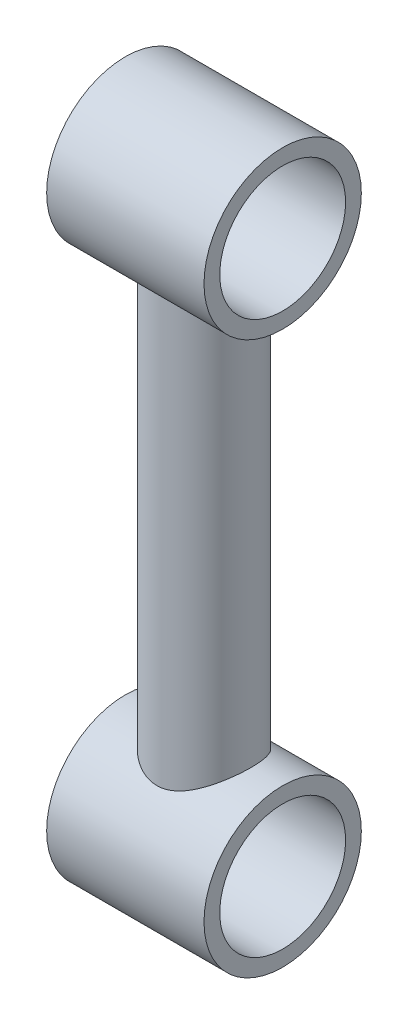
ISO-10303-21;
HEADER;
FILE_DESCRIPTION(('STEP AP214'),'2;1');
FILE_NAME('part.step','',(''),(''),'','','');
FILE_SCHEMA(('AUTOMOTIVE_DESIGN { 1 0 10303 214 1 1 1 1 }'));
ENDSEC;
DATA;
#1=APPLICATION_CONTEXT('core data for automotive mechanical design processes');
#2=APPLICATION_PROTOCOL_DEFINITION('international standard','automotive_design',2000,#1);
#3=PRODUCT_CONTEXT('',#1,'mechanical');
#4=PRODUCT('Part','Part','',(#3));
#5=PRODUCT_RELATED_PRODUCT_CATEGORY('part','',(#4));
#6=PRODUCT_DEFINITION_FORMATION('','',#4);
#7=PRODUCT_DEFINITION_CONTEXT('part definition',#1,'design');
#8=PRODUCT_DEFINITION('design','',#6,#7);
#9=PRODUCT_DEFINITION_SHAPE('','',#8);
#10=(LENGTH_UNIT() NAMED_UNIT(*) SI_UNIT(.MILLI.,.METRE.));
#11=(NAMED_UNIT(*) PLANE_ANGLE_UNIT() SI_UNIT($,.RADIAN.));
#12=(NAMED_UNIT(*) SI_UNIT($,.STERADIAN.) SOLID_ANGLE_UNIT());
#13=UNCERTAINTY_MEASURE_WITH_UNIT(LENGTH_MEASURE(1.E-05),#10,'distance_accuracy_value','');
#14=(GEOMETRIC_REPRESENTATION_CONTEXT(3) GLOBAL_UNCERTAINTY_ASSIGNED_CONTEXT((#13)) GLOBAL_UNIT_ASSIGNED_CONTEXT((#10,
#11,#12)) REPRESENTATION_CONTEXT('',''));
#15=CARTESIAN_POINT('',(0.,0.,0.));
#16=DIRECTION('',(0.,0.,1.));
#17=DIRECTION('',(1.,0.,0.));
#18=AXIS2_PLACEMENT_3D('',#15,#16,#17);
#19=CARTESIAN_POINT('',(-50.,0.,0.));
#20=DIRECTION('',(1.,0.,0.));
#21=DIRECTION('',(0.,0.,-1.));
#22=AXIS2_PLACEMENT_3D('',#19,#20,#21);
#23=CYLINDRICAL_SURFACE('',#22,50.);
#24=CARTESIAN_POINT('',(50.,0.,0.));
#25=DIRECTION('',(1.,0.,0.));
#26=DIRECTION('',(0.,0.,-1.));
#27=AXIS2_PLACEMENT_3D('',#24,#25,#26);
#28=CIRCLE('',#27,50.);
#29=CARTESIAN_POINT('',(50.,0.,-50.));
#30=VERTEX_POINT('',#29);
#31=EDGE_CURVE('E40',#30,#30,#28,.T.);
#32=ORIENTED_EDGE('',*,*,#31,.F.);
#33=EDGE_LOOP('',(#32));
#34=FACE_BOUND('',#33,.T.);
#35=CARTESIAN_POINT('',(-50.,0.,0.));
#36=DIRECTION('',(1.,0.,0.));
#37=DIRECTION('',(0.,0.,-1.));
#38=AXIS2_PLACEMENT_3D('',#35,#36,#37);
#39=CIRCLE('',#38,50.);
#40=CARTESIAN_POINT('',(-50.,0.,-50.));
#41=VERTEX_POINT('',#40);
#42=EDGE_CURVE('E10',#41,#41,#39,.T.);
#43=ORIENTED_EDGE('',*,*,#42,.T.);
#44=EDGE_LOOP('',(#43));
#45=FACE_BOUND('',#44,.T.);
#46=CARTESIAN_POINT('',(0.,-40.,-30.));
#47=CARTESIAN_POINT('',(0.754773079428565,-39.9999924355509,-30.0000054371733));
#48=CARTESIAN_POINT('',(1.50948924622845,-40.0214403954393,-29.9714752342614));
#49=CARTESIAN_POINT('',(3.0122226461602,-40.1062444493847,-29.8578998383123));
#50=CARTESIAN_POINT('',(3.76024032191946,-40.1695977533699,-29.7728584078095));
#51=CARTESIAN_POINT('',(5.2441364599569,-40.3355499097489,-29.5476372030003));
#52=CARTESIAN_POINT('',(5.98000318745316,-40.438184622088,-29.4074070436577));
#53=CARTESIAN_POINT('',(7.43373400086841,-40.6785728662393,-29.0739716563499));
#54=CARTESIAN_POINT('',(8.15159714350204,-40.8163282339694,-28.8807636589501));
#55=CARTESIAN_POINT('',(9.55986424580085,-41.1208174466127,-28.445531905068));
#56=CARTESIAN_POINT('',(10.2504322497716,-41.2873290187728,-28.2038804459786));
#57=CARTESIAN_POINT('',(11.6067524308452,-41.644790948041,-27.6733374325039));
#58=CARTESIAN_POINT('',(12.2725013269922,-41.8357445215649,-27.3844396594046));
#59=CARTESIAN_POINT('',(13.2505717076948,-42.1364605134893,-26.9175218389558));
#60=CARTESIAN_POINT('',(13.5732271148505,-42.2391003045645,-26.756254628249));
#61=CARTESIAN_POINT('',(14.2113934734989,-42.4484734074239,-26.4228282782668));
#62=CARTESIAN_POINT('',(14.5269062595888,-42.5552056486378,-26.2506719799854));
#63=CARTESIAN_POINT('',(15.4626009873731,-42.8806472634173,-25.7181480386));
#64=CARTESIAN_POINT('',(16.0719201724563,-43.1045955804228,-25.3417344973462));
#65=CARTESIAN_POINT('',(17.3324425072035,-43.5893887462092,-24.499575785768));
#66=CARTESIAN_POINT('',(17.9796546133088,-43.8513964328546,-24.0285354757498));
#67=CARTESIAN_POINT('',(19.233290460478,-44.3801358051688,-23.0373408991427));
#68=CARTESIAN_POINT('',(19.8397118501679,-44.6468677620499,-22.5171838053726));
#69=CARTESIAN_POINT('',(21.0099367523766,-45.1790404761606,-21.4294452953907));
#70=CARTESIAN_POINT('',(21.573709768574,-45.4444801847927,-20.8618305432127));
#71=CARTESIAN_POINT('',(22.6556839826832,-45.9679876279243,-19.681488615426));
#72=CARTESIAN_POINT('',(23.1738828552944,-46.2260549858159,-19.0687591408844));
#73=CARTESIAN_POINT('',(24.2153507973842,-46.7564021460829,-17.7316223686081));
#74=CARTESIAN_POINT('',(24.7330987799033,-47.0271973104288,-17.0023054886216));
#75=CARTESIAN_POINT('',(25.7047112154735,-47.5453815754836,-15.4942685286804));
#76=CARTESIAN_POINT('',(26.158569862743,-47.7927685483637,-14.715543968244));
#77=CARTESIAN_POINT('',(26.9971922251109,-48.2568802958075,-13.1136665383535));
#78=CARTESIAN_POINT('',(27.3820041074603,-48.4736264229592,-12.2905451657093));
#79=CARTESIAN_POINT('',(28.0777989799473,-48.870041879193,-10.6050928823802));
#80=CARTESIAN_POINT('',(28.3887941027499,-49.0497173006521,-9.74276844298749));
#81=CARTESIAN_POINT('',(28.9062031952631,-49.3510766635053,-8.06989441005334));
#82=CARTESIAN_POINT('',(29.1197644658465,-49.4766580911894,-7.26225533212928));
#83=CARTESIAN_POINT('',(29.4794276662173,-49.6891894498777,-5.62706899055213));
#84=CARTESIAN_POINT('',(29.6255335070595,-49.7761416205889,-4.79952288403311));
#85=CARTESIAN_POINT('',(29.8478515838854,-49.9087796773502,-3.13246717024253));
#86=CARTESIAN_POINT('',(29.924118545397,-49.9544978737898,-2.29296745458034));
#87=CARTESIAN_POINT('',(30.0056462782551,-50.0033768126454,-0.609322714269916));
#88=CARTESIAN_POINT('',(30.0109142739014,-50.0065418849347,0.234821829012514));
#89=CARTESIAN_POINT('',(29.95415500019,-49.9725033434349,1.81489529981785));
#90=CARTESIAN_POINT('',(29.9004022371462,-49.9402633154867,2.55124667795299));
#91=CARTESIAN_POINT('',(29.739124395353,-49.8438693758083,4.01585794086052));
#92=CARTESIAN_POINT('',(29.6316048566647,-49.7797187521094,4.74411865138387));
#93=CARTESIAN_POINT('',(29.3641437085351,-49.620977165127,6.18756243161352));
#94=CARTESIAN_POINT('',(29.20420022,-49.5263851106974,6.90274503157525));
#95=CARTESIAN_POINT('',(28.8337670024337,-49.3088598139461,8.31547959196037));
#96=CARTESIAN_POINT('',(28.6232751906837,-49.1859254038559,9.01303082461759));
#97=CARTESIAN_POINT('',(28.1526581576168,-48.9135476146462,10.3904072750655));
#98=CARTESIAN_POINT('',(27.8922569228414,-48.7639571594241,11.0701088227145));
#99=CARTESIAN_POINT('',(27.3251067169327,-48.441789827711,12.4041910107697));
#100=CARTESIAN_POINT('',(27.0183581811358,-48.2692131671293,13.0585718889383));
#101=CARTESIAN_POINT('',(26.3610135406394,-47.9043659781244,14.3392870539587));
#102=CARTESIAN_POINT('',(26.0104113625566,-47.7120927225473,14.9656174396906));
#103=CARTESIAN_POINT('',(25.2678641870583,-47.3113861831583,16.1878487666349));
#104=CARTESIAN_POINT('',(24.8759165978422,-47.1029518864841,16.783747796732));
#105=CARTESIAN_POINT('',(24.0038251222862,-46.6479274519125,18.0124884902317));
#106=CARTESIAN_POINT('',(23.5187386533106,-46.3997536842666,18.6412397419404));
#107=CARTESIAN_POINT('',(22.502607304962,-45.8930644751573,19.8559772510624));
#108=CARTESIAN_POINT('',(21.9715592593429,-45.6345483218784,20.4419605571017));
#109=CARTESIAN_POINT('',(20.8653945949799,-45.1123778800076,21.569887598821));
#110=CARTESIAN_POINT('',(20.2902225786288,-44.8487174528413,22.1117741531459));
#111=CARTESIAN_POINT('',(19.0986815642021,-44.3223864406096,23.1487409834838));
#112=CARTESIAN_POINT('',(18.4823106652618,-44.0597159018081,23.6438190972658));
#113=CARTESIAN_POINT('',(17.1365792062999,-43.5114023855333,24.6397506704863));
#114=CARTESIAN_POINT('',(16.4024071704545,-43.2266309181986,25.134607075518));
#115=CARTESIAN_POINT('',(14.8880542042171,-42.6750161739419,26.060187845091));
#116=CARTESIAN_POINT('',(14.107865737769,-42.4081758489753,26.4909016641373));
#117=CARTESIAN_POINT('',(12.5060980569954,-41.9025771259453,27.2835991057643));
#118=CARTESIAN_POINT('',(11.6845832451743,-41.663776855557,27.6456857193192));
#119=CARTESIAN_POINT('',(10.0036296959614,-41.2239700066492,28.2973336841537));
#120=CARTESIAN_POINT('',(9.144206012938,-41.0229485892923,28.586923525734));
#121=CARTESIAN_POINT('',(7.61055439517443,-40.7124607158074,29.0266922229524));
#122=CARTESIAN_POINT('',(6.94318574540926,-40.5926498926779,29.1936352760004));
#123=CARTESIAN_POINT('',(5.59394741557895,-40.3837646228614,29.4819157838905));
#124=CARTESIAN_POINT('',(4.91208006934632,-40.2946852685501,29.6032605207762));
#125=CARTESIAN_POINT('',(3.53871644845567,-40.1504262123343,29.7986252970483));
#126=CARTESIAN_POINT('',(2.847230409919,-40.0952129290315,29.8726922198134));
#127=CARTESIAN_POINT('',(1.45881623193731,-40.0205909917451,29.9725913229736));
#128=CARTESIAN_POINT('',(0.761887977392609,-40.0011830970955,29.9984224804208));
#129=CARTESIAN_POINT('',(-0.633092969562075,-39.9989205730711,30.001439292512));
#130=CARTESIAN_POINT('',(-1.33114588996814,-40.016116263115,29.9785579814936));
#131=CARTESIAN_POINT('',(-2.72212786656803,-40.0864993514701,29.8843768935634));
#132=CARTESIAN_POINT('',(-3.41505689605442,-40.1396869372494,29.8130768644567));
#133=CARTESIAN_POINT('',(-4.79132027707059,-40.2801155116223,29.6230684849219));
#134=CARTESIAN_POINT('',(-5.47464786325117,-40.3673793756117,29.5043282866804));
#135=CARTESIAN_POINT('',(-6.82695351863887,-40.5729035284754,29.2210546703214));
#136=CARTESIAN_POINT('',(-7.49593118416539,-40.6911646881071,29.0565199657639));
#137=CARTESIAN_POINT('',(-8.81493130388343,-40.9546817127304,28.6838971255832));
#138=CARTESIAN_POINT('',(-9.46498244311764,-41.099893970628,28.4758792783311));
#139=CARTESIAN_POINT('',(-10.7447421919884,-41.4133350881076,28.0180764187168));
#140=CARTESIAN_POINT('',(-11.3744425052817,-41.5815731918176,27.7682746224651));
#141=CARTESIAN_POINT('',(-12.6112149171688,-41.9367586997092,27.2288911048792));
#142=CARTESIAN_POINT('',(-13.2182827026054,-42.1237096452986,26.9393018498846));
#143=CARTESIAN_POINT('',(-14.4078239321894,-42.5119906697039,26.3223000055147));
#144=CARTESIAN_POINT('',(-14.9903036233565,-42.713317060781,25.9948971032765));
#145=CARTESIAN_POINT('',(-16.2323716245478,-43.1636078905243,25.2414085206861));
#146=CARTESIAN_POINT('',(-16.8868967379914,-43.4146109863377,24.8081780488878));
#147=CARTESIAN_POINT('',(-18.1580335537829,-43.9246536038002,23.8934940052003));
#148=CARTESIAN_POINT('',(-18.7746418168658,-44.1836938512659,23.4120360691993));
#149=CARTESIAN_POINT('',(-19.9684598947072,-44.7040326920285,22.4025038732756));
#150=CARTESIAN_POINT('',(-20.5456347277241,-44.9653330646558,21.8743891519663));
#151=CARTESIAN_POINT('',(-21.6578301169655,-45.4842796758364,20.7737943393439));
#152=CARTESIAN_POINT('',(-22.1928484895119,-45.7419257245319,20.2013119528565));
#153=CARTESIAN_POINT('',(-23.2851001855273,-46.2811171660542,18.9364779766343));
#154=CARTESIAN_POINT('',(-23.8361500707667,-46.5614043507672,18.2382257014387));
#155=CARTESIAN_POINT('',(-24.8772013130106,-47.1028396436449,16.7904682073809));
#156=CARTESIAN_POINT('',(-25.367196421245,-47.3639857916585,16.0409577545394));
#157=CARTESIAN_POINT('',(-26.281262214501,-47.8597679650153,14.4948690885772));
#158=CARTESIAN_POINT('',(-26.7053644094267,-48.0944166466547,13.6983136253921));
#159=CARTESIAN_POINT('',(-27.4829085808844,-48.5304710877414,12.0627242110709));
#160=CARTESIAN_POINT('',(-27.8363601907911,-48.731881378668,11.2236960707639));
#161=CARTESIAN_POINT('',(-28.4447091895007,-49.0820154369011,9.57163089673217));
#162=CARTESIAN_POINT('',(-28.7048990218314,-49.2335028420043,8.76112996669413));
#163=CARTESIAN_POINT('',(-29.1565507968783,-49.4981910314828,7.11503534150898));
#164=CARTESIAN_POINT('',(-29.3480152961319,-49.6113932400335,6.27944258101491));
#165=CARTESIAN_POINT('',(-29.6590072808807,-49.7959943798632,4.59121918613498));
#166=CARTESIAN_POINT('',(-29.7786025195841,-49.8674326814406,3.73860538410504));
#167=CARTESIAN_POINT('',(-29.9440494730322,-49.9664050743555,2.02375863082273));
#168=CARTESIAN_POINT('',(-29.989910800952,-49.9939448890237,1.16152694827898));
#169=CARTESIAN_POINT('',(-30.0059636845279,-50.0035796163062,-0.44863836959643));
#170=CARTESIAN_POINT('',(-29.9854383726646,-49.9912497430118,-1.19646649879256));
#171=CARTESIAN_POINT('',(-29.8887419424398,-49.9333091422452,-2.68715701856051));
#172=CARTESIAN_POINT('',(-29.8125768518574,-49.8877020198906,-3.43001993824537));
#173=CARTESIAN_POINT('',(-29.6056163790939,-49.7643009048837,-4.90534527411017));
#174=CARTESIAN_POINT('',(-29.4748213780623,-49.6865071367958,-5.63780776281639));
#175=CARTESIAN_POINT('',(-29.160245460038,-49.5005437474305,-7.0873223698818));
#176=CARTESIAN_POINT('',(-28.9764629550249,-49.3923732157727,-7.80437402569054));
#177=CARTESIAN_POINT('',(-28.5614260115334,-49.1500473875609,-9.20713596965784));
#178=CARTESIAN_POINT('',(-28.3309850756384,-49.0163393490528,-9.89316522831643));
#179=CARTESIAN_POINT('',(-27.8232155122072,-48.7246154429874,-11.242249514208));
#180=CARTESIAN_POINT('',(-27.5458880423398,-48.5666001756052,-11.9053051081935));
#181=CARTESIAN_POINT('',(-26.946769704929,-48.2293178600434,-13.2054545723106));
#182=CARTESIAN_POINT('',(-26.6249739638318,-48.0500484828003,-13.8425455868989));
#183=CARTESIAN_POINT('',(-25.9393946780803,-47.6735789595604,-15.0881846024373));
#184=CARTESIAN_POINT('',(-25.5756084922492,-47.4763776858225,-15.6967308045441));
#185=CARTESIAN_POINT('',(-24.7667424868672,-47.0453184951055,-16.9476190424841));
#186=CARTESIAN_POINT('',(-24.317124761882,-46.8098051726833,-17.5864585689585));
#187=CARTESIAN_POINT('',(-23.3721450786188,-46.325936934833,-18.8241654588664));
#188=CARTESIAN_POINT('',(-22.876780423972,-46.0775812628444,-19.4230304625739));
#189=CARTESIAN_POINT('',(-21.8424161446594,-45.5728772295248,-20.5793876993337));
#190=CARTESIAN_POINT('',(-21.3033730570058,-45.3165210670254,-21.1368376378641));
#191=CARTESIAN_POINT('',(-20.1844237054672,-44.8013865884645,-22.2078589213948));
#192=CARTESIAN_POINT('',(-19.6045150692523,-44.5426081325414,-22.7214277151681));
#193=CARTESIAN_POINT('',(-18.329631573187,-43.9954895932492,-23.7652386100365));
#194=CARTESIAN_POINT('',(-17.6293953373685,-43.7075675480209,-24.2893195038196));
#195=CARTESIAN_POINT('',(-16.5443485377289,-43.2851540783708,-25.0295083694434));
#196=CARTESIAN_POINT('',(-16.1768518277079,-43.1459165421275,-25.2686007562634));
#197=CARTESIAN_POINT('',(-15.4304379178484,-42.8716442524079,-25.731195664513));
#198=CARTESIAN_POINT('',(-15.0515165547962,-42.7366110683665,-25.9546924020116));
#199=CARTESIAN_POINT('',(-13.8987545541486,-42.3397557549876,-26.6007590168042));
#200=CARTESIAN_POINT('',(-13.1084169941735,-42.0859808338299,-26.999246247833));
#201=CARTESIAN_POINT('',(-11.4877271374779,-41.6097198076573,-27.7276182166737));
#202=CARTESIAN_POINT('',(-10.6573852109229,-41.3872256518336,-28.0575206168377));
#203=CARTESIAN_POINT('',(-9.42187298081651,-41.0929389990196,-28.4850286249539));
#204=CARTESIAN_POINT('',(-9.03038758470868,-41.0048657325039,-28.6115719641199));
#205=CARTESIAN_POINT('',(-8.24078837678755,-40.8382373313778,-28.8489055913011));
#206=CARTESIAN_POINT('',(-7.84267626508385,-40.7596797970073,-28.9596998522838));
#207=CARTESIAN_POINT('',(-6.63922693192673,-40.5395886546573,-29.2678307379545));
#208=CARTESIAN_POINT('',(-5.82460119453231,-40.4135940279387,-29.440976404297));
#209=CARTESIAN_POINT('',(-4.17951386891395,-40.209493955114,-29.7191257226127));
#210=CARTESIAN_POINT('',(-3.34908470349394,-40.1312994945307,-29.8242560556143));
#211=CARTESIAN_POINT('',(-1.67907944636471,-40.0265599738779,-29.9646857763522));
#212=CARTESIAN_POINT('',(-0.839504519189612,-40.0000084136404,-29.9999939524452));
#213=CARTESIAN_POINT('',(0.,-40.,-30.));
#214=B_SPLINE_CURVE_WITH_KNOTS('',3,(#46,#47,#48,#49,#50,#51,#52,#53,#54,#55,#56,#57,#58,#59,
#60,#61,#62,#63,#64,#65,#66,#67,#68,#69,#70,#71,#72,#73,#74,#75,#76,#77,#78,#79,#80,#81,#82,#83,
#84,#85,#86,#87,#88,#89,#90,#91,#92,#93,#94,#95,#96,#97,#98,#99,#100,#101,#102,#103,#104,#105,
#106,#107,#108,#109,#110,#111,#112,#113,#114,#115,#116,#117,#118,#119,#120,#121,#122,#123,#124,
#125,#126,#127,#128,#129,#130,#131,#132,#133,#134,#135,#136,#137,#138,#139,#140,#141,#142,#143,
#144,#145,#146,#147,#148,#149,#150,#151,#152,#153,#154,#155,#156,#157,#158,#159,#160,#161,#162,
#163,#164,#165,#166,#167,#168,#169,#170,#171,#172,#173,#174,#175,#176,#177,#178,#179,#180,#181,
#182,#183,#184,#185,#186,#187,#188,#189,#190,#191,#192,#193,#194,#195,#196,#197,#198,#199,#200,
#201,#202,#203,#204,#205,#206,#207,#208,#209,#210,#211,#212,#213),.UNSPECIFIED.,.T.,.F.,(4,2,2,
2,2,2,2,2,2,2,2,2,2,2,2,2,2,2,2,2,2,2,2,2,2,2,2,2,2,2,2,2,2,2,2,2,2,2,2,2,2,2,2,2,2,2,2,2,2,2,2,
2,2,2,2,2,2,2,2,2,2,2,2,2,2,2,2,2,2,2,2,2,2,2,2,2,2,2,2,2,2,2,2,4),(0.,2.26339065976523,
4.52663063739906,6.79194167103308,9.05737114715353,11.3060153718576,13.5549558090047,
14.6798398054329,15.8044315174353,18.053680844433,20.578006829107,23.1024782036475,
25.6287380005962,28.1551266186056,30.954941350871,33.7550103451903,36.553118342749,
39.3507661189212,41.8814765390891,44.4120402106454,46.9406192393127,49.4689409776018,
51.683333411791,53.8974977247651,56.1117414113421,58.3260763460167,60.5530302662239,
62.7799632701391,65.0072050288865,67.2345864887666,69.7280443332067,72.2216740863463,
74.71848750613,77.2154162053875,80.002108172649,82.7892577871951,85.5721909336379,
88.354028700165,90.446781170665,92.5391992867496,94.6295392047497,96.7199234526042,
98.8131832342802,100.906453919041,103.001132238211,105.095869406138,107.187246361405,
109.279465412906,111.372081168462,113.46416201983,115.933925800171,118.403913272111,
120.876064180349,123.348343060374,126.142642921312,128.937228535818,131.730473642596,
134.523337623591,137.113418055671,139.703402128459,142.290940703078,144.878141895905,
147.120010063233,149.361635392023,151.603245081396,153.844921958156,156.05044208409,
158.25590776179,160.461615342147,162.667461736035,165.112763633141,167.558209750834,
170.006119860739,172.454172194157,175.21302745175,176.592687183034,177.972855896356,
180.731292892543,183.489018638118,184.750877047949,186.012416565873,188.534926127152,
191.052723792891,193.57020452896),.UNSPECIFIED.);
#215=CARTESIAN_POINT('',(0.,-40.,-30.));
#216=VERTEX_POINT('',#215);
#217=EDGE_CURVE('E55',#216,#216,#214,.T.);
#218=ORIENTED_EDGE('',*,*,#217,.F.);
#219=EDGE_LOOP('',(#218));
#220=FACE_BOUND('',#219,.T.);
#221=ADVANCED_FACE('F37',(#34,#45,#220),#23,.T.);
#222=CARTESIAN_POINT('',(-50.,0.,0.));
#223=DIRECTION('',(1.,0.,0.));
#224=DIRECTION('',(0.,0.,-1.));
#225=AXIS2_PLACEMENT_3D('',#222,#223,#224);
#226=PLANE('',#225);
#227=CARTESIAN_POINT('',(-50.,0.,0.));
#228=DIRECTION('',(1.,0.,0.));
#229=DIRECTION('',(0.,0.,-1.));
#230=AXIS2_PLACEMENT_3D('',#227,#228,#229);
#231=CIRCLE('',#230,40.);
#232=CARTESIAN_POINT('',(-50.,0.,-40.));
#233=VERTEX_POINT('',#232);
#234=EDGE_CURVE('E49',#233,#233,#231,.T.);
#235=ORIENTED_EDGE('',*,*,#234,.T.);
#236=EDGE_LOOP('',(#235));
#237=FACE_BOUND('',#236,.T.);
#238=ORIENTED_EDGE('',*,*,#42,.F.);
#239=EDGE_LOOP('',(#238));
#240=FACE_BOUND('',#239,.T.);
#241=ADVANCED_FACE('F101',(#237,#240),#226,.F.);
#242=CARTESIAN_POINT('',(50.,0.,0.));
#243=DIRECTION('',(1.,0.,0.));
#244=DIRECTION('',(0.,0.,-1.));
#245=AXIS2_PLACEMENT_3D('',#242,#243,#244);
#246=PLANE('',#245);
#247=CARTESIAN_POINT('',(50.,0.,0.));
#248=DIRECTION('',(1.,0.,0.));
#249=DIRECTION('',(0.,0.,-1.));
#250=AXIS2_PLACEMENT_3D('',#247,#248,#249);
#251=CIRCLE('',#250,40.);
#252=CARTESIAN_POINT('',(50.,0.,-40.));
#253=VERTEX_POINT('',#252);
#254=EDGE_CURVE('E51',#253,#253,#251,.T.);
#255=ORIENTED_EDGE('',*,*,#254,.F.);
#256=EDGE_LOOP('',(#255));
#257=FACE_BOUND('',#256,.T.);
#258=ORIENTED_EDGE('',*,*,#31,.T.);
#259=EDGE_LOOP('',(#258));
#260=FACE_BOUND('',#259,.T.);
#261=ADVANCED_FACE('F106',(#257,#260),#246,.T.);
#262=CARTESIAN_POINT('',(-50.,0.,0.));
#263=DIRECTION('',(1.,0.,0.));
#264=DIRECTION('',(0.,0.,-1.));
#265=AXIS2_PLACEMENT_3D('',#262,#263,#264);
#266=CYLINDRICAL_SURFACE('',#265,40.);
#267=ORIENTED_EDGE('',*,*,#234,.F.);
#268=EDGE_LOOP('',(#267));
#269=FACE_BOUND('',#268,.T.);
#270=ORIENTED_EDGE('',*,*,#254,.T.);
#271=EDGE_LOOP('',(#270));
#272=FACE_BOUND('',#271,.T.);
#273=ADVANCED_FACE('F115',(#269,#272),#266,.F.);
#274=CARTESIAN_POINT('',(0.,50.001,0.));
#275=DIRECTION('',(0.,-1.,0.));
#276=DIRECTION('',(0.,0.,-1.));
#277=AXIS2_PLACEMENT_3D('',#274,#275,#276);
#278=CYLINDRICAL_SURFACE('',#277,30.);
#279=ORIENTED_EDGE('',*,*,#217,.T.);
#280=EDGE_LOOP('',(#279));
#281=FACE_BOUND('',#280,.T.);
#282=CARTESIAN_POINT('',(0.,-311.2,30.));
#283=CARTESIAN_POINT('',(-0.754773079428563,-311.200007564449,30.0000054371733));
#284=CARTESIAN_POINT('',(-1.50948924622845,-311.178559604561,29.9714752342614));
#285=CARTESIAN_POINT('',(-3.0122226461602,-311.093755550615,29.8578998383123));
#286=CARTESIAN_POINT('',(-3.76024032191946,-311.03040224663,29.7728584078095));
#287=CARTESIAN_POINT('',(-5.2441364599569,-310.864450090251,29.5476372030003));
#288=CARTESIAN_POINT('',(-5.98000318745316,-310.761815377912,29.4074070436577));
#289=CARTESIAN_POINT('',(-7.43373400086841,-310.521427133761,29.0739716563499));
#290=CARTESIAN_POINT('',(-8.15159714350204,-310.383671766031,28.8807636589501));
#291=CARTESIAN_POINT('',(-9.55986424580085,-310.079182553387,28.445531905068));
#292=CARTESIAN_POINT('',(-10.2504322497716,-309.912670981227,28.2038804459786));
#293=CARTESIAN_POINT('',(-11.6067524308452,-309.555209051959,27.6733374325039));
#294=CARTESIAN_POINT('',(-12.2725013269922,-309.364255478435,27.3844396594046));
#295=CARTESIAN_POINT('',(-13.2505717076948,-309.063539486511,26.9175218389557));
#296=CARTESIAN_POINT('',(-13.5732271148505,-308.960899695436,26.756254628249));
#297=CARTESIAN_POINT('',(-14.211393473499,-308.751526592576,26.4228282782668));
#298=CARTESIAN_POINT('',(-14.5269062595888,-308.644794351362,26.2506719799853));
#299=CARTESIAN_POINT('',(-15.4626009873731,-308.319352736583,25.7181480386));
#300=CARTESIAN_POINT('',(-16.0719201724563,-308.095404419577,25.3417344973462));
#301=CARTESIAN_POINT('',(-17.3324425072035,-307.610611253791,24.499575785768));
#302=CARTESIAN_POINT('',(-17.9796546133088,-307.348603567146,24.0285354757498));
#303=CARTESIAN_POINT('',(-19.233290460478,-306.819864194831,23.0373408991427));
#304=CARTESIAN_POINT('',(-19.8397118501679,-306.55313223795,22.5171838053726));
#305=CARTESIAN_POINT('',(-21.0099367523766,-306.020959523839,21.4294452953907));
#306=CARTESIAN_POINT('',(-21.573709768574,-305.755519815207,20.8618305432127));
#307=CARTESIAN_POINT('',(-22.6556839826831,-305.232012372076,19.681488615426));
#308=CARTESIAN_POINT('',(-23.1738828552944,-304.973945014184,19.0687591408844));
#309=CARTESIAN_POINT('',(-24.2153507973842,-304.443597853917,17.7316223686081));
#310=CARTESIAN_POINT('',(-24.7330987799033,-304.172802689571,17.0023054886216));
#311=CARTESIAN_POINT('',(-25.7047112154735,-303.654618424516,15.4942685286804));
#312=CARTESIAN_POINT('',(-26.158569862743,-303.407231451636,14.715543968244));
#313=CARTESIAN_POINT('',(-26.9971922251109,-302.943119704192,13.1136665383535));
#314=CARTESIAN_POINT('',(-27.3820041074603,-302.726373577041,12.2905451657093));
#315=CARTESIAN_POINT('',(-28.0777989799473,-302.329958120807,10.6050928823802));
#316=CARTESIAN_POINT('',(-28.3887941027499,-302.150282699348,9.74276844298749));
#317=CARTESIAN_POINT('',(-28.9062031952631,-301.848923336495,8.06989441005334));
#318=CARTESIAN_POINT('',(-29.1197644658465,-301.723341908811,7.26225533212928));
#319=CARTESIAN_POINT('',(-29.4794276662173,-301.510810550122,5.62706899055213));
#320=CARTESIAN_POINT('',(-29.6255335070595,-301.423858379411,4.79952288403311));
#321=CARTESIAN_POINT('',(-29.8478515838854,-301.29122032265,3.13246717024253));
#322=CARTESIAN_POINT('',(-29.924118545397,-301.24550212621,2.29296745458034));
#323=CARTESIAN_POINT('',(-30.0056462782551,-301.196623187355,0.609322714269924));
#324=CARTESIAN_POINT('',(-30.0109142739014,-301.193458115065,-0.234821829012507));
#325=CARTESIAN_POINT('',(-29.95415500019,-301.227496656565,-1.81489529981785));
#326=CARTESIAN_POINT('',(-29.9004022371462,-301.259736684513,-2.55124667795299));
#327=CARTESIAN_POINT('',(-29.739124395353,-301.356130624192,-4.01585794086052));
#328=CARTESIAN_POINT('',(-29.6316048566647,-301.420281247891,-4.74411865138387));
#329=CARTESIAN_POINT('',(-29.3641437085351,-301.579022834873,-6.18756243161353));
#330=CARTESIAN_POINT('',(-29.20420022,-301.673614889303,-6.90274503157526));
#331=CARTESIAN_POINT('',(-28.8337670024337,-301.891140186054,-8.31547959196037));
#332=CARTESIAN_POINT('',(-28.6232751906837,-302.014074596144,-9.0130308246176));
#333=CARTESIAN_POINT('',(-28.1526581576168,-302.286452385354,-10.3904072750655));
#334=CARTESIAN_POINT('',(-27.8922569228414,-302.436042840576,-11.0701088227145));
#335=CARTESIAN_POINT('',(-27.3251067169327,-302.758210172289,-12.4041910107697));
#336=CARTESIAN_POINT('',(-27.0183581811358,-302.930786832871,-13.0585718889383));
#337=CARTESIAN_POINT('',(-26.3610135406394,-303.295634021876,-14.3392870539587));
#338=CARTESIAN_POINT('',(-26.0104113625566,-303.487907277453,-14.9656174396906));
#339=CARTESIAN_POINT('',(-25.2678641870583,-303.888613816842,-16.1878487666349));
#340=CARTESIAN_POINT('',(-24.8759165978422,-304.097048113516,-16.783747796732));
#341=CARTESIAN_POINT('',(-24.0038251222862,-304.552072548087,-18.0124884902317));
#342=CARTESIAN_POINT('',(-23.5187386533106,-304.800246315733,-18.6412397419404));
#343=CARTESIAN_POINT('',(-22.502607304962,-305.306935524843,-19.8559772510624));
#344=CARTESIAN_POINT('',(-21.9715592593429,-305.565451678122,-20.4419605571017));
#345=CARTESIAN_POINT('',(-20.8653945949799,-306.087622119992,-21.5698875988211));
#346=CARTESIAN_POINT('',(-20.2902225786288,-306.351282547159,-22.1117741531459));
#347=CARTESIAN_POINT('',(-19.0986815642021,-306.87761355939,-23.1487409834838));
#348=CARTESIAN_POINT('',(-18.4823106652618,-307.140284098192,-23.6438190972658));
#349=CARTESIAN_POINT('',(-17.1365792062999,-307.688597614467,-24.6397506704863));
#350=CARTESIAN_POINT('',(-16.4024071704545,-307.973369081801,-25.134607075518));
#351=CARTESIAN_POINT('',(-14.8880542042171,-308.524983826058,-26.060187845091));
#352=CARTESIAN_POINT('',(-14.107865737769,-308.791824151025,-26.4909016641373));
#353=CARTESIAN_POINT('',(-12.5060980569954,-309.297422874055,-27.2835991057643));
#354=CARTESIAN_POINT('',(-11.6845832451744,-309.536223144443,-27.6456857193192));
#355=CARTESIAN_POINT('',(-10.0036296959614,-309.976029993351,-28.2973336841537));
#356=CARTESIAN_POINT('',(-9.144206012938,-310.177051410708,-28.586923525734));
#357=CARTESIAN_POINT('',(-7.61055439517443,-310.487539284193,-29.0266922229524));
#358=CARTESIAN_POINT('',(-6.94318574540926,-310.607350107322,-29.1936352760004));
#359=CARTESIAN_POINT('',(-5.59394741557896,-310.816235377139,-29.4819157838905));
#360=CARTESIAN_POINT('',(-4.91208006934632,-310.90531473145,-29.6032605207762));
#361=CARTESIAN_POINT('',(-3.53871644845567,-311.049573787666,-29.7986252970483));
#362=CARTESIAN_POINT('',(-2.847230409919,-311.104787070969,-29.8726922198134));
#363=CARTESIAN_POINT('',(-1.45881623193732,-311.179409008255,-29.9725913229736));
#364=CARTESIAN_POINT('',(-0.761887977392608,-311.198816902905,-29.9984224804208));
#365=CARTESIAN_POINT('',(0.633092969562079,-311.201079426929,-30.001439292512));
#366=CARTESIAN_POINT('',(1.33114588996815,-311.183883736885,-29.9785579814936));
#367=CARTESIAN_POINT('',(2.72212786656804,-311.11350064853,-29.8843768935634));
#368=CARTESIAN_POINT('',(3.41505689605444,-311.060313062751,-29.8130768644567));
#369=CARTESIAN_POINT('',(4.79132027707061,-310.919884488378,-29.6230684849219));
#370=CARTESIAN_POINT('',(5.47464786325119,-310.832620624388,-29.5043282866804));
#371=CARTESIAN_POINT('',(6.82695351863888,-310.627096471525,-29.2210546703214));
#372=CARTESIAN_POINT('',(7.4959311841654,-310.508835311893,-29.0565199657639));
#373=CARTESIAN_POINT('',(8.81493130388344,-310.24531828727,-28.6838971255832));
#374=CARTESIAN_POINT('',(9.46498244311765,-310.100106029372,-28.4758792783311));
#375=CARTESIAN_POINT('',(10.7447421919885,-309.786664911892,-28.0180764187168));
#376=CARTESIAN_POINT('',(11.3744425052817,-309.618426808182,-27.7682746224651));
#377=CARTESIAN_POINT('',(12.6112149171688,-309.263241300291,-27.2288911048792));
#378=CARTESIAN_POINT('',(13.2182827026054,-309.076290354701,-26.9393018498846));
#379=CARTESIAN_POINT('',(14.4078239321894,-308.688009330296,-26.3223000055147));
#380=CARTESIAN_POINT('',(14.9903036233565,-308.486682939219,-25.9948971032765));
#381=CARTESIAN_POINT('',(16.2323716245478,-308.036392109476,-25.2414085206861));
#382=CARTESIAN_POINT('',(16.8868967379914,-307.785389013662,-24.8081780488878));
#383=CARTESIAN_POINT('',(18.158033553783,-307.2753463962,-23.8934940052002));
#384=CARTESIAN_POINT('',(18.7746418168658,-307.016306148734,-23.4120360691993));
#385=CARTESIAN_POINT('',(19.9684598947072,-306.495967307972,-22.4025038732755));
#386=CARTESIAN_POINT('',(20.5456347277241,-306.234666935344,-21.8743891519663));
#387=CARTESIAN_POINT('',(21.6578301169655,-305.715720324164,-20.7737943393439));
#388=CARTESIAN_POINT('',(22.1928484895119,-305.458074275468,-20.2013119528565));
#389=CARTESIAN_POINT('',(23.2851001855273,-304.918882833946,-18.9364779766342));
#390=CARTESIAN_POINT('',(23.8361500707668,-304.638595649233,-18.2382257014387));
#391=CARTESIAN_POINT('',(24.8772013130107,-304.097160356355,-16.7904682073808));
#392=CARTESIAN_POINT('',(25.367196421245,-303.836014208342,-16.0409577545394));
#393=CARTESIAN_POINT('',(26.281262214501,-303.340232034985,-14.4948690885771));
#394=CARTESIAN_POINT('',(26.7053644094267,-303.105583353345,-13.6983136253921));
#395=CARTESIAN_POINT('',(27.4829085808844,-302.669528912259,-12.0627242110709));
#396=CARTESIAN_POINT('',(27.8363601907911,-302.468118621332,-11.2236960707639));
#397=CARTESIAN_POINT('',(28.4447091895007,-302.117984563099,-9.57163089673215));
#398=CARTESIAN_POINT('',(28.7048990218314,-301.966497157996,-8.7611299666941));
#399=CARTESIAN_POINT('',(29.1565507968783,-301.701808968517,-7.11503534150893));
#400=CARTESIAN_POINT('',(29.3480152961319,-301.588606759967,-6.27944258101487));
#401=CARTESIAN_POINT('',(29.6590072808808,-301.404005620137,-4.59121918613493));
#402=CARTESIAN_POINT('',(29.7786025195841,-301.332567318559,-3.738605384105));
#403=CARTESIAN_POINT('',(29.9440494730322,-301.233594925645,-2.02375863082269));
#404=CARTESIAN_POINT('',(29.989910800952,-301.206055110976,-1.16152694827895));
#405=CARTESIAN_POINT('',(30.0059636845279,-301.196420383694,0.448638369596459));
#406=CARTESIAN_POINT('',(29.9854383726646,-301.208750256988,1.19646649879259));
#407=CARTESIAN_POINT('',(29.8887419424398,-301.266690857755,2.68715701856054));
#408=CARTESIAN_POINT('',(29.8125768518574,-301.312297980109,3.43001993824539));
#409=CARTESIAN_POINT('',(29.6056163790939,-301.435699095116,4.90534527411017));
#410=CARTESIAN_POINT('',(29.4748213780623,-301.513492863204,5.63780776281639));
#411=CARTESIAN_POINT('',(29.160245460038,-301.69945625257,7.0873223698818));
#412=CARTESIAN_POINT('',(28.9764629550249,-301.807626784227,7.80437402569054));
#413=CARTESIAN_POINT('',(28.5614260115334,-302.049952612439,9.20713596965785));
#414=CARTESIAN_POINT('',(28.3309850756384,-302.183660650947,9.89316522831643));
#415=CARTESIAN_POINT('',(27.8232155122072,-302.475384557013,11.242249514208));
#416=CARTESIAN_POINT('',(27.5458880423398,-302.633399824395,11.9053051081935));
#417=CARTESIAN_POINT('',(26.946769704929,-302.970682139957,13.2054545723106));
#418=CARTESIAN_POINT('',(26.6249739638318,-303.1499515172,13.8425455868989));
#419=CARTESIAN_POINT('',(25.9393946780803,-303.52642104044,15.0881846024373));
#420=CARTESIAN_POINT('',(25.5756084922492,-303.723622314177,15.6967308045441));
#421=CARTESIAN_POINT('',(24.7667424868672,-304.154681504895,16.9476190424841));
#422=CARTESIAN_POINT('',(24.317124761882,-304.390194827317,17.5864585689585));
#423=CARTESIAN_POINT('',(23.3721450786188,-304.874063065167,18.8241654588664));
#424=CARTESIAN_POINT('',(22.876780423972,-305.122418737156,19.4230304625739));
#425=CARTESIAN_POINT('',(21.8424161446594,-305.627122770475,20.5793876993337));
#426=CARTESIAN_POINT('',(21.3033730570058,-305.883478932975,21.1368376378641));
#427=CARTESIAN_POINT('',(20.1844237054672,-306.398613411535,22.2078589213948));
#428=CARTESIAN_POINT('',(19.6045150692523,-306.657391867459,22.7214277151681));
#429=CARTESIAN_POINT('',(18.329631573187,-307.204510406751,23.7652386100365));
#430=CARTESIAN_POINT('',(17.6293953373685,-307.492432451979,24.2893195038196));
#431=CARTESIAN_POINT('',(16.5443485377289,-307.914845921629,25.0295083694434));
#432=CARTESIAN_POINT('',(16.1768518277079,-308.054083457872,25.2686007562634));
#433=CARTESIAN_POINT('',(15.4304379178484,-308.328355747592,25.731195664513));
#434=CARTESIAN_POINT('',(15.0515165547962,-308.463388931634,25.9546924020116));
#435=CARTESIAN_POINT('',(13.8987545541486,-308.860244245012,26.6007590168042));
#436=CARTESIAN_POINT('',(13.1084169941735,-309.11401916617,26.999246247833));
#437=CARTESIAN_POINT('',(11.4877271374778,-309.590280192343,27.7276182166738));
#438=CARTESIAN_POINT('',(10.6573852109228,-309.812774348166,28.0575206168377));
#439=CARTESIAN_POINT('',(9.4218729808165,-310.10706100098,28.4850286249539));
#440=CARTESIAN_POINT('',(9.03038758470866,-310.195134267496,28.6115719641199));
#441=CARTESIAN_POINT('',(8.24078837678754,-310.361762668622,28.8489055913011));
#442=CARTESIAN_POINT('',(7.84267626508384,-310.440320202993,28.9596998522838));
#443=CARTESIAN_POINT('',(6.63922693192672,-310.660411345343,29.2678307379545));
#444=CARTESIAN_POINT('',(5.82460119453229,-310.786405972061,29.440976404297));
#445=CARTESIAN_POINT('',(4.17951386891393,-310.990506044886,29.7191257226127));
#446=CARTESIAN_POINT('',(3.34908470349393,-311.068700505469,29.8242560556143));
#447=CARTESIAN_POINT('',(1.67907944636471,-311.173440026122,29.9646857763522));
#448=CARTESIAN_POINT('',(0.839504519189612,-311.19999158636,29.9999939524452));
#449=CARTESIAN_POINT('',(0.,-311.2,30.));
#450=B_SPLINE_CURVE_WITH_KNOTS('',3,(#282,#283,#284,#285,#286,#287,#288,#289,#290,#291,#292,
#293,#294,#295,#296,#297,#298,#299,#300,#301,#302,#303,#304,#305,#306,#307,#308,#309,#310,#311,
#312,#313,#314,#315,#316,#317,#318,#319,#320,#321,#322,#323,#324,#325,#326,#327,#328,#329,#330,
#331,#332,#333,#334,#335,#336,#337,#338,#339,#340,#341,#342,#343,#344,#345,#346,#347,#348,#349,
#350,#351,#352,#353,#354,#355,#356,#357,#358,#359,#360,#361,#362,#363,#364,#365,#366,#367,#368,
#369,#370,#371,#372,#373,#374,#375,#376,#377,#378,#379,#380,#381,#382,#383,#384,#385,#386,#387,
#388,#389,#390,#391,#392,#393,#394,#395,#396,#397,#398,#399,#400,#401,#402,#403,#404,#405,#406,
#407,#408,#409,#410,#411,#412,#413,#414,#415,#416,#417,#418,#419,#420,#421,#422,#423,#424,#425,
#426,#427,#428,#429,#430,#431,#432,#433,#434,#435,#436,#437,#438,#439,#440,#441,#442,#443,#444,
#445,#446,#447,#448,#449),.UNSPECIFIED.,.T.,.F.,(4,2,2,2,2,2,2,2,2,2,2,2,2,2,2,2,2,2,2,2,2,2,2,
2,2,2,2,2,2,2,2,2,2,2,2,2,2,2,2,2,2,2,2,2,2,2,2,2,2,2,2,2,2,2,2,2,2,2,2,2,2,2,2,2,2,2,2,2,2,2,2,
2,2,2,2,2,2,2,2,2,2,2,2,4),(0.,2.26339065976522,4.52663063739905,6.79194167103309,
9.05737114715353,11.3060153718576,13.5549558090047,14.6798398054329,15.8044315174353,
18.053680844433,20.578006829107,23.1024782036474,25.6287380005962,28.1551266186055,
30.954941350871,33.7550103451904,36.553118342749,39.3507661189212,41.8814765390891,
44.4120402106454,46.9406192393127,49.4689409776018,51.683333411791,53.8974977247652,
56.1117414113421,58.3260763460167,60.5530302662239,62.7799632701391,65.0072050288865,
67.2345864887666,69.7280443332067,72.2216740863464,74.71848750613,77.2154162053875,
80.002108172649,82.7892577871951,85.5721909336379,88.3540287001651,90.4467811706651,
92.5391992867497,94.6295392047498,96.7199234526042,98.8131832342802,100.906453919041,
103.001132238211,105.095869406138,107.187246361405,109.279465412906,111.372081168463,
113.46416201983,115.933925800171,118.403913272112,120.876064180349,123.348343060374,
126.142642921312,128.937228535818,131.730473642596,134.523337623591,137.113418055671,
139.703402128459,142.290940703078,144.878141895905,147.120010063233,149.361635392023,
151.603245081396,153.844921958156,156.050442084091,158.25590776179,160.461615342147,
162.667461736035,165.112763633141,167.558209750834,170.006119860739,172.454172194157,
175.21302745175,176.592687183034,177.972855896356,180.731292892543,183.489018638118,
184.750877047949,186.012416565873,188.534926127152,191.052723792891,193.57020452896),.UNSPECIFIED.);
#451=CARTESIAN_POINT('',(0.,-311.2,30.));
#452=VERTEX_POINT('',#451);
#453=EDGE_CURVE('E67',#452,#452,#450,.T.);
#454=ORIENTED_EDGE('',*,*,#453,.F.);
#455=EDGE_LOOP('',(#454));
#456=FACE_BOUND('',#455,.T.);
#457=ADVANCED_FACE('F74',(#281,#456),#278,.T.);
#458=CARTESIAN_POINT('',(-50.,-351.2,0.));
#459=DIRECTION('',(1.,0.,0.));
#460=DIRECTION('',(0.,0.,-1.));
#461=AXIS2_PLACEMENT_3D('',#458,#459,#460);
#462=CYLINDRICAL_SURFACE('',#461,50.);
#463=CARTESIAN_POINT('',(50.,-351.2,0.));
#464=DIRECTION('',(-1.,0.,0.));
#465=DIRECTION('',(0.,0.,-1.));
#466=AXIS2_PLACEMENT_3D('',#463,#464,#465);
#467=CIRCLE('',#466,50.);
#468=CARTESIAN_POINT('',(50.,-351.2,-50.));
#469=VERTEX_POINT('',#468);
#470=EDGE_CURVE('E123',#469,#469,#467,.T.);
#471=ORIENTED_EDGE('',*,*,#470,.T.);
#472=EDGE_LOOP('',(#471));
#473=FACE_BOUND('',#472,.T.);
#474=CARTESIAN_POINT('',(-50.,-351.2,0.));
#475=DIRECTION('',(-1.,0.,0.));
#476=DIRECTION('',(0.,0.,-1.));
#477=AXIS2_PLACEMENT_3D('',#474,#475,#476);
#478=CIRCLE('',#477,50.);
#479=CARTESIAN_POINT('',(-50.,-351.2,-50.));
#480=VERTEX_POINT('',#479);
#481=EDGE_CURVE('E120',#480,#480,#478,.T.);
#482=ORIENTED_EDGE('',*,*,#481,.F.);
#483=EDGE_LOOP('',(#482));
#484=FACE_BOUND('',#483,.T.);
#485=ORIENTED_EDGE('',*,*,#453,.T.);
#486=EDGE_LOOP('',(#485));
#487=FACE_BOUND('',#486,.T.);
#488=ADVANCED_FACE('F81',(#473,#484,#487),#462,.T.);
#489=CARTESIAN_POINT('',(-50.,-351.2,0.));
#490=DIRECTION('',(1.,0.,0.));
#491=DIRECTION('',(0.,0.,-1.));
#492=AXIS2_PLACEMENT_3D('',#489,#490,#491);
#493=PLANE('',#492);
#494=ORIENTED_EDGE('',*,*,#481,.T.);
#495=EDGE_LOOP('',(#494));
#496=FACE_BOUND('',#495,.T.);
#497=CARTESIAN_POINT('',(-50.,-351.2,0.));
#498=DIRECTION('',(-1.,0.,0.));
#499=DIRECTION('',(0.,0.,-1.));
#500=AXIS2_PLACEMENT_3D('',#497,#498,#499);
#501=CIRCLE('',#500,40.);
#502=CARTESIAN_POINT('',(-50.,-351.2,-40.));
#503=VERTEX_POINT('',#502);
#504=EDGE_CURVE('E128',#503,#503,#501,.T.);
#505=ORIENTED_EDGE('',*,*,#504,.F.);
#506=EDGE_LOOP('',(#505));
#507=FACE_BOUND('',#506,.T.);
#508=ADVANCED_FACE('F84',(#496,#507),#493,.F.);
#509=CARTESIAN_POINT('',(50.,-351.2,0.));
#510=DIRECTION('',(1.,0.,0.));
#511=DIRECTION('',(0.,0.,-1.));
#512=AXIS2_PLACEMENT_3D('',#509,#510,#511);
#513=PLANE('',#512);
#514=ORIENTED_EDGE('',*,*,#470,.F.);
#515=EDGE_LOOP('',(#514));
#516=FACE_BOUND('',#515,.T.);
#517=CARTESIAN_POINT('',(50.,-351.2,0.));
#518=DIRECTION('',(-1.,0.,0.));
#519=DIRECTION('',(0.,0.,-1.));
#520=AXIS2_PLACEMENT_3D('',#517,#518,#519);
#521=CIRCLE('',#520,40.);
#522=CARTESIAN_POINT('',(50.,-351.2,-40.));
#523=VERTEX_POINT('',#522);
#524=EDGE_CURVE('E130',#523,#523,#521,.T.);
#525=ORIENTED_EDGE('',*,*,#524,.T.);
#526=EDGE_LOOP('',(#525));
#527=FACE_BOUND('',#526,.T.);
#528=ADVANCED_FACE('F86',(#516,#527),#513,.T.);
#529=CARTESIAN_POINT('',(-50.,-351.2,0.));
#530=DIRECTION('',(1.,0.,0.));
#531=DIRECTION('',(0.,0.,-1.));
#532=AXIS2_PLACEMENT_3D('',#529,#530,#531);
#533=CYLINDRICAL_SURFACE('',#532,40.);
#534=ORIENTED_EDGE('',*,*,#504,.T.);
#535=EDGE_LOOP('',(#534));
#536=FACE_BOUND('',#535,.T.);
#537=ORIENTED_EDGE('',*,*,#524,.F.);
#538=EDGE_LOOP('',(#537));
#539=FACE_BOUND('',#538,.T.);
#540=ADVANCED_FACE('F89',(#536,#539),#533,.F.);
#541=CLOSED_SHELL('',(#221,#241,#261,#273,#457,#488,#508,#528,#540));
#542=MANIFOLD_SOLID_BREP('B2',#541);
#543=ADVANCED_BREP_SHAPE_REPRESENTATION('',(#18,#542),#14);
#544=SHAPE_DEFINITION_REPRESENTATION(#9,#543);
ENDSEC;
END-ISO-10303-21;
